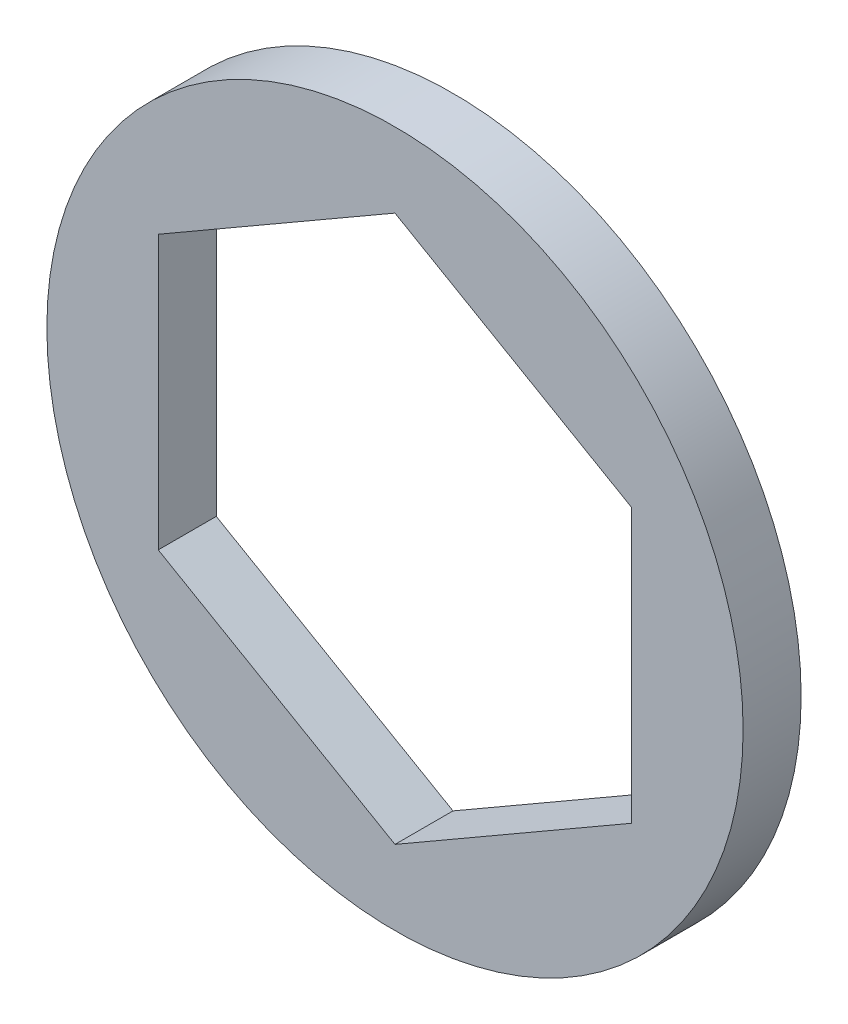
ISO-10303-21;
HEADER;
FILE_DESCRIPTION(('STEP AP214'),'2;1');
FILE_NAME('part.step','',(''),(''),'','','');
FILE_SCHEMA(('AUTOMOTIVE_DESIGN { 1 0 10303 214 1 1 1 1 }'));
ENDSEC;
DATA;
#1=APPLICATION_CONTEXT('core data for automotive mechanical design processes');
#2=APPLICATION_PROTOCOL_DEFINITION('international standard','automotive_design',2000,#1);
#3=PRODUCT_CONTEXT('',#1,'mechanical');
#4=PRODUCT('Part','Part','',(#3));
#5=PRODUCT_RELATED_PRODUCT_CATEGORY('part','',(#4));
#6=PRODUCT_DEFINITION_FORMATION('','',#4);
#7=PRODUCT_DEFINITION_CONTEXT('part definition',#1,'design');
#8=PRODUCT_DEFINITION('design','',#6,#7);
#9=PRODUCT_DEFINITION_SHAPE('','',#8);
#10=(LENGTH_UNIT() NAMED_UNIT(*) SI_UNIT(.MILLI.,.METRE.));
#11=(NAMED_UNIT(*) PLANE_ANGLE_UNIT() SI_UNIT($,.RADIAN.));
#12=(NAMED_UNIT(*) SI_UNIT($,.STERADIAN.) SOLID_ANGLE_UNIT());
#13=UNCERTAINTY_MEASURE_WITH_UNIT(LENGTH_MEASURE(1.E-05),#10,'distance_accuracy_value','');
#14=(GEOMETRIC_REPRESENTATION_CONTEXT(3) GLOBAL_UNCERTAINTY_ASSIGNED_CONTEXT((#13)) GLOBAL_UNIT_ASSIGNED_CONTEXT((#10,
#11,#12)) REPRESENTATION_CONTEXT('',''));
#15=CARTESIAN_POINT('',(0.,0.,0.));
#16=DIRECTION('',(0.,0.,1.));
#17=DIRECTION('',(1.,0.,0.));
#18=AXIS2_PLACEMENT_3D('',#15,#16,#17);
#19=CARTESIAN_POINT('',(0.,0.,0.79375));
#20=DIRECTION('',(0.,0.,1.));
#21=DIRECTION('',(1.,0.,0.));
#22=AXIS2_PLACEMENT_3D('',#19,#20,#21);
#23=PLANE('',#22);
#24=CARTESIAN_POINT('',(0.,0.,0.79375));
#25=DIRECTION('',(0.,0.,1.));
#26=DIRECTION('',(1.,0.,0.));
#27=AXIS2_PLACEMENT_3D('',#24,#25,#26);
#28=CIRCLE('',#27,9.525);
#29=CARTESIAN_POINT('',(9.525,0.,0.79375));
#30=VERTEX_POINT('',#29);
#31=EDGE_CURVE('E11',#30,#30,#28,.T.);
#32=ORIENTED_EDGE('',*,*,#31,.T.);
#33=EDGE_LOOP('',(#32));
#34=FACE_BOUND('',#33,.T.);
#35=DIRECTION('',(-0.866025403784438,-0.5,0.));
#36=VECTOR('',#35,1.);
#37=CARTESIAN_POINT('',(0.,7.47899538708241,0.79375));
#38=LINE('',#37,#36);
#39=CARTESIAN_POINT('',(0.,7.47899538708241,0.79375));
#40=VERTEX_POINT('',#39);
#41=CARTESIAN_POINT('',(-6.477,3.73949769354121,0.79375));
#42=VERTEX_POINT('',#41);
#43=EDGE_CURVE('E108',#40,#42,#38,.T.);
#44=ORIENTED_EDGE('',*,*,#43,.F.);
#45=DIRECTION('',(-0.866025403784439,0.5,0.));
#46=VECTOR('',#45,1.);
#47=CARTESIAN_POINT('',(6.477,3.73949769354121,0.79375));
#48=LINE('',#47,#46);
#49=CARTESIAN_POINT('',(6.477,3.73949769354121,0.79375));
#50=VERTEX_POINT('',#49);
#51=EDGE_CURVE('E99',#50,#40,#48,.T.);
#52=ORIENTED_EDGE('',*,*,#51,.F.);
#53=DIRECTION('',(0.,1.,0.));
#54=VECTOR('',#53,1.);
#55=CARTESIAN_POINT('',(6.477,-3.7394976935412,0.79375));
#56=LINE('',#55,#54);
#57=CARTESIAN_POINT('',(6.477,-3.7394976935412,0.79375));
#58=VERTEX_POINT('',#57);
#59=EDGE_CURVE('E133',#58,#50,#56,.T.);
#60=ORIENTED_EDGE('',*,*,#59,.F.);
#61=DIRECTION('',(0.866025403784439,0.5,0.));
#62=VECTOR('',#61,1.);
#63=CARTESIAN_POINT('',(0.,-7.47899538708241,0.79375));
#64=LINE('',#63,#62);
#65=CARTESIAN_POINT('',(0.,-7.47899538708241,0.79375));
#66=VERTEX_POINT('',#65);
#67=EDGE_CURVE('E130',#66,#58,#64,.T.);
#68=ORIENTED_EDGE('',*,*,#67,.F.);
#69=DIRECTION('',(0.866025403784439,-0.5,0.));
#70=VECTOR('',#69,1.);
#71=CARTESIAN_POINT('',(-6.477,-3.73949769354121,0.79375));
#72=LINE('',#71,#70);
#73=CARTESIAN_POINT('',(-6.477,-3.73949769354121,0.79375));
#74=VERTEX_POINT('',#73);
#75=EDGE_CURVE('E125',#74,#66,#72,.T.);
#76=ORIENTED_EDGE('',*,*,#75,.F.);
#77=DIRECTION('',(0.,-1.,0.));
#78=VECTOR('',#77,1.);
#79=CARTESIAN_POINT('',(-6.477,3.73949769354121,0.79375));
#80=LINE('',#79,#78);
#81=EDGE_CURVE('E121',#42,#74,#80,.T.);
#82=ORIENTED_EDGE('',*,*,#81,.F.);
#83=EDGE_LOOP('',(#44,#52,#60,#68,#76,#82));
#84=FACE_BOUND('',#83,.T.);
#85=ADVANCED_FACE('F45',(#34,#84),#23,.T.);
#86=CARTESIAN_POINT('',(0.,0.,-0.79375));
#87=DIRECTION('',(0.,0.,1.));
#88=DIRECTION('',(1.,0.,0.));
#89=AXIS2_PLACEMENT_3D('',#86,#87,#88);
#90=PLANE('',#89);
#91=CARTESIAN_POINT('',(0.,0.,-0.79375));
#92=DIRECTION('',(0.,0.,1.));
#93=DIRECTION('',(1.,0.,0.));
#94=AXIS2_PLACEMENT_3D('',#91,#92,#93);
#95=CIRCLE('',#94,9.525);
#96=CARTESIAN_POINT('',(9.525,0.,-0.79375));
#97=VERTEX_POINT('',#96);
#98=EDGE_CURVE('E49',#97,#97,#95,.T.);
#99=ORIENTED_EDGE('',*,*,#98,.F.);
#100=EDGE_LOOP('',(#99));
#101=FACE_BOUND('',#100,.T.);
#102=DIRECTION('',(-0.866025403784439,0.5,0.));
#103=VECTOR('',#102,1.);
#104=CARTESIAN_POINT('',(6.477,3.73949769354121,-0.79375));
#105=LINE('',#104,#103);
#106=CARTESIAN_POINT('',(6.477,3.73949769354121,-0.79375));
#107=VERTEX_POINT('',#106);
#108=CARTESIAN_POINT('',(0.,7.47899538708241,-0.79375));
#109=VERTEX_POINT('',#108);
#110=EDGE_CURVE('E69',#107,#109,#105,.T.);
#111=ORIENTED_EDGE('',*,*,#110,.T.);
#112=DIRECTION('',(-0.866025403784438,-0.5,0.));
#113=VECTOR('',#112,1.);
#114=CARTESIAN_POINT('',(0.,7.47899538708241,-0.79375));
#115=LINE('',#114,#113);
#116=CARTESIAN_POINT('',(-6.477,3.73949769354121,-0.79375));
#117=VERTEX_POINT('',#116);
#118=EDGE_CURVE('E115',#109,#117,#115,.T.);
#119=ORIENTED_EDGE('',*,*,#118,.T.);
#120=DIRECTION('',(0.,-1.,0.));
#121=VECTOR('',#120,1.);
#122=CARTESIAN_POINT('',(-6.477,3.73949769354121,-0.79375));
#123=LINE('',#122,#121);
#124=CARTESIAN_POINT('',(-6.477,-3.73949769354121,-0.79375));
#125=VERTEX_POINT('',#124);
#126=EDGE_CURVE('E140',#117,#125,#123,.T.);
#127=ORIENTED_EDGE('',*,*,#126,.T.);
#128=DIRECTION('',(0.866025403784439,-0.5,0.));
#129=VECTOR('',#128,1.);
#130=CARTESIAN_POINT('',(-6.477,-3.73949769354121,-0.79375));
#131=LINE('',#130,#129);
#132=CARTESIAN_POINT('',(0.,-7.47899538708241,-0.79375));
#133=VERTEX_POINT('',#132);
#134=EDGE_CURVE('E144',#125,#133,#131,.T.);
#135=ORIENTED_EDGE('',*,*,#134,.T.);
#136=DIRECTION('',(0.866025403784439,0.5,0.));
#137=VECTOR('',#136,1.);
#138=CARTESIAN_POINT('',(0.,-7.47899538708241,-0.79375));
#139=LINE('',#138,#137);
#140=CARTESIAN_POINT('',(6.477,-3.7394976935412,-0.79375));
#141=VERTEX_POINT('',#140);
#142=EDGE_CURVE('E148',#133,#141,#139,.T.);
#143=ORIENTED_EDGE('',*,*,#142,.T.);
#144=DIRECTION('',(0.,1.,0.));
#145=VECTOR('',#144,1.);
#146=CARTESIAN_POINT('',(6.477,-3.7394976935412,-0.79375));
#147=LINE('',#146,#145);
#148=EDGE_CURVE('E109',#141,#107,#147,.T.);
#149=ORIENTED_EDGE('',*,*,#148,.T.);
#150=EDGE_LOOP('',(#111,#119,#127,#135,#143,#149));
#151=FACE_BOUND('',#150,.T.);
#152=ADVANCED_FACE('F172',(#101,#151),#90,.F.);
#153=CARTESIAN_POINT('',(0.,0.,0.79375));
#154=DIRECTION('',(0.,0.,-1.));
#155=DIRECTION('',(-1.,0.,0.));
#156=AXIS2_PLACEMENT_3D('',#153,#154,#155);
#157=CYLINDRICAL_SURFACE('',#156,9.525);
#158=ORIENTED_EDGE('',*,*,#31,.F.);
#159=EDGE_LOOP('',(#158));
#160=FACE_BOUND('',#159,.T.);
#161=ORIENTED_EDGE('',*,*,#98,.T.);
#162=EDGE_LOOP('',(#161));
#163=FACE_BOUND('',#162,.T.);
#164=ADVANCED_FACE('F47',(#160,#163),#157,.T.);
#165=CARTESIAN_POINT('',(6.477,3.73949769354121,0.79375));
#166=DIRECTION('',(-0.5,-0.866025403784439,0.));
#167=DIRECTION('',(0.866025403784439,-0.5,0.));
#168=AXIS2_PLACEMENT_3D('',#165,#166,#167);
#169=PLANE('',#168);
#170=ORIENTED_EDGE('',*,*,#110,.F.);
#171=DIRECTION('',(0.,0.,-1.));
#172=VECTOR('',#171,1.);
#173=CARTESIAN_POINT('',(6.477,3.73949769354121,0.79375));
#174=LINE('',#173,#172);
#175=EDGE_CURVE('E103',#50,#107,#174,.T.);
#176=ORIENTED_EDGE('',*,*,#175,.F.);
#177=ORIENTED_EDGE('',*,*,#51,.T.);
#178=DIRECTION('',(0.,0.,-1.));
#179=VECTOR('',#178,1.);
#180=CARTESIAN_POINT('',(0.,7.47899538708241,0.79375));
#181=LINE('',#180,#179);
#182=EDGE_CURVE('E102',#40,#109,#181,.T.);
#183=ORIENTED_EDGE('',*,*,#182,.T.);
#184=EDGE_LOOP('',(#170,#176,#177,#183));
#185=FACE_BOUND('',#184,.T.);
#186=ADVANCED_FACE('F101',(#185),#169,.T.);
#187=CARTESIAN_POINT('',(0.,7.47899538708241,0.79375));
#188=DIRECTION('',(0.5,-0.866025403784438,0.));
#189=DIRECTION('',(0.866025403784439,0.5,0.));
#190=AXIS2_PLACEMENT_3D('',#187,#188,#189);
#191=PLANE('',#190);
#192=ORIENTED_EDGE('',*,*,#118,.F.);
#193=ORIENTED_EDGE('',*,*,#182,.F.);
#194=ORIENTED_EDGE('',*,*,#43,.T.);
#195=DIRECTION('',(0.,0.,-1.));
#196=VECTOR('',#195,1.);
#197=CARTESIAN_POINT('',(-6.477,3.73949769354121,0.79375));
#198=LINE('',#197,#196);
#199=EDGE_CURVE('E117',#42,#117,#198,.T.);
#200=ORIENTED_EDGE('',*,*,#199,.T.);
#201=EDGE_LOOP('',(#192,#193,#194,#200));
#202=FACE_BOUND('',#201,.T.);
#203=ADVANCED_FACE('F112',(#202),#191,.T.);
#204=CARTESIAN_POINT('',(-6.477,3.73949769354121,0.79375));
#205=DIRECTION('',(1.,0.,0.));
#206=DIRECTION('',(0.,1.,0.));
#207=AXIS2_PLACEMENT_3D('',#204,#205,#206);
#208=PLANE('',#207);
#209=ORIENTED_EDGE('',*,*,#126,.F.);
#210=ORIENTED_EDGE('',*,*,#199,.F.);
#211=ORIENTED_EDGE('',*,*,#81,.T.);
#212=DIRECTION('',(0.,0.,-1.));
#213=VECTOR('',#212,1.);
#214=CARTESIAN_POINT('',(-6.477,-3.73949769354121,0.79375));
#215=LINE('',#214,#213);
#216=EDGE_CURVE('E162',#74,#125,#215,.T.);
#217=ORIENTED_EDGE('',*,*,#216,.T.);
#218=EDGE_LOOP('',(#209,#210,#211,#217));
#219=FACE_BOUND('',#218,.T.);
#220=ADVANCED_FACE('F168',(#219),#208,.T.);
#221=CARTESIAN_POINT('',(-6.477,-3.73949769354121,0.79375));
#222=DIRECTION('',(0.5,0.866025403784439,0.));
#223=DIRECTION('',(-0.866025403784439,0.5,0.));
#224=AXIS2_PLACEMENT_3D('',#221,#222,#223);
#225=PLANE('',#224);
#226=ORIENTED_EDGE('',*,*,#134,.F.);
#227=ORIENTED_EDGE('',*,*,#216,.F.);
#228=ORIENTED_EDGE('',*,*,#75,.T.);
#229=DIRECTION('',(0.,0.,-1.));
#230=VECTOR('',#229,1.);
#231=CARTESIAN_POINT('',(0.,-7.47899538708241,0.79375));
#232=LINE('',#231,#230);
#233=EDGE_CURVE('E159',#66,#133,#232,.T.);
#234=ORIENTED_EDGE('',*,*,#233,.T.);
#235=EDGE_LOOP('',(#226,#227,#228,#234));
#236=FACE_BOUND('',#235,.T.);
#237=ADVANCED_FACE('F180',(#236),#225,.T.);
#238=CARTESIAN_POINT('',(0.,-7.47899538708241,0.79375));
#239=DIRECTION('',(-0.5,0.866025403784439,0.));
#240=DIRECTION('',(-0.866025403784439,-0.5,0.));
#241=AXIS2_PLACEMENT_3D('',#238,#239,#240);
#242=PLANE('',#241);
#243=ORIENTED_EDGE('',*,*,#142,.F.);
#244=ORIENTED_EDGE('',*,*,#233,.F.);
#245=ORIENTED_EDGE('',*,*,#67,.T.);
#246=DIRECTION('',(0.,0.,-1.));
#247=VECTOR('',#246,1.);
#248=CARTESIAN_POINT('',(6.477,-3.7394976935412,0.79375));
#249=LINE('',#248,#247);
#250=EDGE_CURVE('E61',#58,#141,#249,.T.);
#251=ORIENTED_EDGE('',*,*,#250,.T.);
#252=EDGE_LOOP('',(#243,#244,#245,#251));
#253=FACE_BOUND('',#252,.T.);
#254=ADVANCED_FACE('F178',(#253),#242,.T.);
#255=CARTESIAN_POINT('',(6.477,-3.7394976935412,0.79375));
#256=DIRECTION('',(-1.,0.,0.));
#257=DIRECTION('',(0.,-1.,0.));
#258=AXIS2_PLACEMENT_3D('',#255,#256,#257);
#259=PLANE('',#258);
#260=ORIENTED_EDGE('',*,*,#148,.F.);
#261=ORIENTED_EDGE('',*,*,#250,.F.);
#262=ORIENTED_EDGE('',*,*,#59,.T.);
#263=ORIENTED_EDGE('',*,*,#175,.T.);
#264=EDGE_LOOP('',(#260,#261,#262,#263));
#265=FACE_BOUND('',#264,.T.);
#266=ADVANCED_FACE('F174',(#265),#259,.T.);
#267=CLOSED_SHELL('',(#85,#152,#164,#186,#203,#220,#237,#254,#266));
#268=MANIFOLD_SOLID_BREP('B2',#267);
#269=ADVANCED_BREP_SHAPE_REPRESENTATION('',(#18,#268),#14);
#270=SHAPE_DEFINITION_REPRESENTATION(#9,#269);
ENDSEC;
END-ISO-10303-21;
